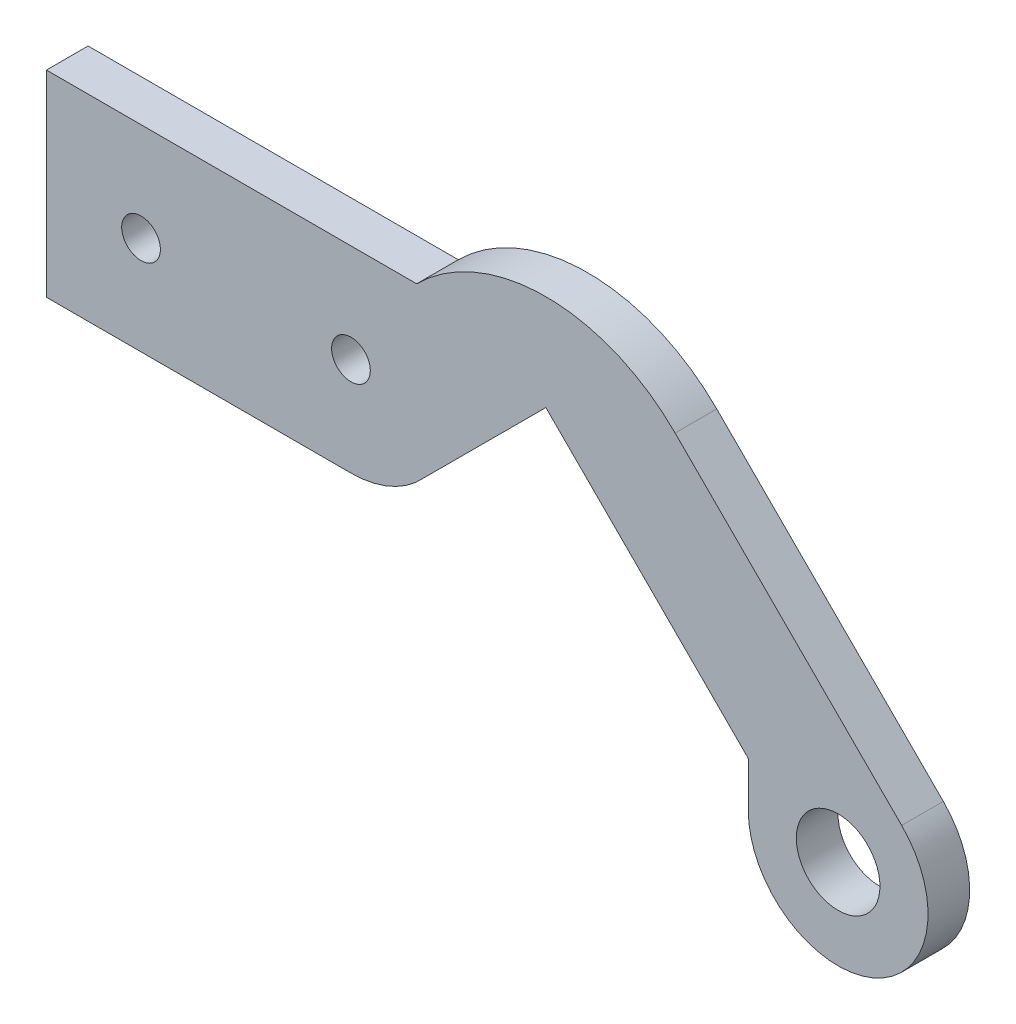
ISO-10303-21;
HEADER;
FILE_DESCRIPTION(('STEP AP214'),'2;1');
FILE_NAME('part.step','',(''),(''),'','','');
FILE_SCHEMA(('AUTOMOTIVE_DESIGN { 1 0 10303 214 1 1 1 1 }'));
ENDSEC;
DATA;
#1=APPLICATION_CONTEXT('core data for automotive mechanical design processes');
#2=APPLICATION_PROTOCOL_DEFINITION('international standard','automotive_design',2000,#1);
#3=PRODUCT_CONTEXT('',#1,'mechanical');
#4=PRODUCT('Part','Part','',(#3));
#5=PRODUCT_RELATED_PRODUCT_CATEGORY('part','',(#4));
#6=PRODUCT_DEFINITION_FORMATION('','',#4);
#7=PRODUCT_DEFINITION_CONTEXT('part definition',#1,'design');
#8=PRODUCT_DEFINITION('design','',#6,#7);
#9=PRODUCT_DEFINITION_SHAPE('','',#8);
#10=(LENGTH_UNIT() NAMED_UNIT(*) SI_UNIT(.MILLI.,.METRE.));
#11=(NAMED_UNIT(*) PLANE_ANGLE_UNIT() SI_UNIT($,.RADIAN.));
#12=(NAMED_UNIT(*) SI_UNIT($,.STERADIAN.) SOLID_ANGLE_UNIT());
#13=UNCERTAINTY_MEASURE_WITH_UNIT(LENGTH_MEASURE(1.E-05),#10,'distance_accuracy_value','');
#14=(GEOMETRIC_REPRESENTATION_CONTEXT(3) GLOBAL_UNCERTAINTY_ASSIGNED_CONTEXT((#13)) GLOBAL_UNIT_ASSIGNED_CONTEXT((#10,
#11,#12)) REPRESENTATION_CONTEXT('',''));
#15=CARTESIAN_POINT('',(0.,0.,0.));
#16=DIRECTION('',(0.,0.,1.));
#17=DIRECTION('',(1.,0.,0.));
#18=AXIS2_PLACEMENT_3D('',#15,#16,#17);
#19=CARTESIAN_POINT('',(0.,0.,3.175));
#20=DIRECTION('',(0.,0.,1.));
#21=DIRECTION('',(1.,0.,0.));
#22=AXIS2_PLACEMENT_3D('',#19,#20,#21);
#23=PLANE('',#22);
#24=CARTESIAN_POINT('',(-13.5,0.,3.175));
#25=DIRECTION('',(0.,0.,1.));
#26=DIRECTION('',(1.,0.,0.));
#27=AXIS2_PLACEMENT_3D('',#24,#25,#26);
#28=CIRCLE('',#27,1.475);
#29=CARTESIAN_POINT('',(-12.025,0.,3.175));
#30=VERTEX_POINT('',#29);
#31=EDGE_CURVE('E291',#30,#30,#28,.T.);
#32=ORIENTED_EDGE('',*,*,#31,.F.);
#33=EDGE_LOOP('',(#32));
#34=FACE_BOUND('',#33,.T.);
#35=CARTESIAN_POINT('',(2.5,0.,3.175));
#36=DIRECTION('',(0.,0.,1.));
#37=DIRECTION('',(1.,0.,0.));
#38=AXIS2_PLACEMENT_3D('',#35,#36,#37);
#39=CIRCLE('',#38,1.475);
#40=CARTESIAN_POINT('',(3.975,0.,3.175));
#41=VERTEX_POINT('',#40);
#42=EDGE_CURVE('E290',#41,#41,#39,.T.);
#43=ORIENTED_EDGE('',*,*,#42,.F.);
#44=EDGE_LOOP('',(#43));
#45=FACE_BOUND('',#44,.T.);
#46=DIRECTION('',(0.707106781186546,-0.707106781186549,0.));
#47=VECTOR('',#46,1.);
#48=CARTESIAN_POINT('',(17.3544964901299,17.3544964901299,3.175));
#49=LINE('',#48,#47);
#50=CARTESIAN_POINT('',(27.2089929802598,7.5,3.175));
#51=VERTEX_POINT('',#50);
#52=CARTESIAN_POINT('',(44.4795253726149,-9.77053239235524,3.175));
#53=VERTEX_POINT('',#52);
#54=EDGE_CURVE('E231',#51,#53,#49,.T.);
#55=ORIENTED_EDGE('',*,*,#54,.F.);
#56=CARTESIAN_POINT('',(17.3584345872163,-2.35055839304351,3.175));
#57=DIRECTION('',(0.,0.,1.));
#58=DIRECTION('',(1.,0.,0.));
#59=AXIS2_PLACEMENT_3D('',#56,#57,#58);
#60=CIRCLE('',#59,13.9307932763902);
#61=CARTESIAN_POINT('',(7.5078761941729,7.5,3.175));
#62=VERTEX_POINT('',#61);
#63=EDGE_CURVE('E228',#62,#51,#60,.F.);
#64=ORIENTED_EDGE('',*,*,#63,.F.);
#65=DIRECTION('',(1.,0.,0.));
#66=VECTOR('',#65,1.);
#67=CARTESIAN_POINT('',(-20.71,7.5,3.175));
#68=LINE('',#67,#66);
#69=CARTESIAN_POINT('',(-20.71,7.5,3.175));
#70=VERTEX_POINT('',#69);
#71=EDGE_CURVE('E216',#70,#62,#68,.T.);
#72=ORIENTED_EDGE('',*,*,#71,.F.);
#73=DIRECTION('',(0.,-1.,0.));
#74=VECTOR('',#73,1.);
#75=CARTESIAN_POINT('',(-20.71,0.,3.175));
#76=LINE('',#75,#74);
#77=CARTESIAN_POINT('',(-20.71,-7.5,3.175));
#78=VERTEX_POINT('',#77);
#79=EDGE_CURVE('E297',#70,#78,#76,.T.);
#80=ORIENTED_EDGE('',*,*,#79,.T.);
#81=DIRECTION('',(1.,0.,0.));
#82=VECTOR('',#81,1.);
#83=CARTESIAN_POINT('',(0.,-7.5,3.175));
#84=LINE('',#83,#82);
#85=CARTESIAN_POINT('',(2.5,-7.5,3.175));
#86=VERTEX_POINT('',#85);
#87=EDGE_CURVE('E12',#78,#86,#84,.T.);
#88=ORIENTED_EDGE('',*,*,#87,.T.);
#89=CARTESIAN_POINT('',(2.5,0.,3.175));
#90=DIRECTION('',(0.,0.,1.));
#91=DIRECTION('',(1.,0.,0.));
#92=AXIS2_PLACEMENT_3D('',#89,#90,#91);
#93=CIRCLE('',#92,7.5);
#94=CARTESIAN_POINT('',(8.03869510450984,-5.05696119614128,3.175));
#95=VERTEX_POINT('',#94);
#96=EDGE_CURVE('E287',#86,#95,#93,.T.);
#97=ORIENTED_EDGE('',*,*,#96,.T.);
#98=DIRECTION('',(0.707457856158301,0.706755531821223,0.));
#99=VECTOR('',#98,1.);
#100=CARTESIAN_POINT('',(6.54383474051305,-6.55033754691378,3.175));
#101=LINE('',#100,#99);
#102=CARTESIAN_POINT('',(17.3584345872163,4.25352617381113,3.175));
#103=VERTEX_POINT('',#102);
#104=EDGE_CURVE('E258',#95,#103,#101,.T.);
#105=ORIENTED_EDGE('',*,*,#104,.T.);
#106=DIRECTION('',(-0.706755531821223,0.707457856158301,0.));
#107=VECTOR('',#106,1.);
#108=CARTESIAN_POINT('',(32.7858439214871,-11.1892138434832,3.175));
#109=LINE('',#108,#107);
#110=CARTESIAN_POINT('',(32.7858439214871,-11.1892138434832,3.175));
#111=VERTEX_POINT('',#110);
#112=EDGE_CURVE('E164',#111,#103,#109,.T.);
#113=ORIENTED_EDGE('',*,*,#112,.F.);
#114=DIRECTION('',(0.,1.,0.));
#115=VECTOR('',#114,1.);
#116=CARTESIAN_POINT('',(32.7858439214871,-14.6142138434831,3.175));
#117=LINE('',#116,#115);
#118=CARTESIAN_POINT('',(32.7858439214871,-14.6142138434831,3.175));
#119=VERTEX_POINT('',#118);
#120=EDGE_CURVE('E269',#119,#111,#117,.T.);
#121=ORIENTED_EDGE('',*,*,#120,.F.);
#122=CARTESIAN_POINT('',(39.6358439214871,-14.6142138434831,3.175));
#123=DIRECTION('',(0.,0.,1.));
#124=DIRECTION('',(1.,0.,0.));
#125=AXIS2_PLACEMENT_3D('',#122,#123,#124);
#126=CIRCLE('',#125,6.85);
#127=EDGE_CURVE('E277',#53,#119,#126,.F.);
#128=ORIENTED_EDGE('',*,*,#127,.F.);
#129=EDGE_LOOP('',(#55,#64,#72,#80,#88,#97,#105,#113,#121,#128));
#130=FACE_BOUND('',#129,.T.);
#131=CARTESIAN_POINT('',(39.6358439214871,-14.6142138434831,3.175));
#132=DIRECTION('',(0.,0.,1.));
#133=DIRECTION('',(1.,0.,0.));
#134=AXIS2_PLACEMENT_3D('',#131,#132,#133);
#135=CIRCLE('',#134,3.1875);
#136=CARTESIAN_POINT('',(42.8233439214871,-14.6142138434831,3.175));
#137=VERTEX_POINT('',#136);
#138=EDGE_CURVE('E240',#137,#137,#135,.F.);
#139=ORIENTED_EDGE('',*,*,#138,.T.);
#140=EDGE_LOOP('',(#139));
#141=FACE_BOUND('',#140,.T.);
#142=ADVANCED_FACE('F139',(#34,#45,#130,#141),#23,.T.);
#143=CARTESIAN_POINT('',(0.,0.,0.));
#144=DIRECTION('',(0.,0.,1.));
#145=DIRECTION('',(1.,0.,0.));
#146=AXIS2_PLACEMENT_3D('',#143,#144,#145);
#147=PLANE('',#146);
#148=CARTESIAN_POINT('',(-13.5,0.,0.));
#149=DIRECTION('',(0.,0.,1.));
#150=DIRECTION('',(1.,0.,0.));
#151=AXIS2_PLACEMENT_3D('',#148,#149,#150);
#152=CIRCLE('',#151,1.475);
#153=CARTESIAN_POINT('',(-12.025,0.,0.));
#154=VERTEX_POINT('',#153);
#155=EDGE_CURVE('E143',#154,#154,#152,.T.);
#156=ORIENTED_EDGE('',*,*,#155,.T.);
#157=EDGE_LOOP('',(#156));
#158=FACE_BOUND('',#157,.T.);
#159=CARTESIAN_POINT('',(2.5,0.,0.));
#160=DIRECTION('',(0.,0.,1.));
#161=DIRECTION('',(1.,0.,0.));
#162=AXIS2_PLACEMENT_3D('',#159,#160,#161);
#163=CIRCLE('',#162,1.475);
#164=CARTESIAN_POINT('',(3.975,0.,0.));
#165=VERTEX_POINT('',#164);
#166=EDGE_CURVE('E294',#165,#165,#163,.T.);
#167=ORIENTED_EDGE('',*,*,#166,.T.);
#168=EDGE_LOOP('',(#167));
#169=FACE_BOUND('',#168,.T.);
#170=DIRECTION('',(1.,0.,0.));
#171=VECTOR('',#170,1.);
#172=CARTESIAN_POINT('',(-20.71,7.5,0.));
#173=LINE('',#172,#171);
#174=CARTESIAN_POINT('',(-20.71,7.5,0.));
#175=VERTEX_POINT('',#174);
#176=CARTESIAN_POINT('',(7.50787619417291,7.5,0.));
#177=VERTEX_POINT('',#176);
#178=EDGE_CURVE('E224',#175,#177,#173,.T.);
#179=ORIENTED_EDGE('',*,*,#178,.T.);
#180=CARTESIAN_POINT('',(17.3584345872163,-2.35055839304351,0.));
#181=DIRECTION('',(0.,0.,-1.));
#182=DIRECTION('',(1.,0.,0.));
#183=AXIS2_PLACEMENT_3D('',#180,#181,#182);
#184=CIRCLE('',#183,13.9307932763902);
#185=CARTESIAN_POINT('',(27.2089929802598,7.5,0.));
#186=VERTEX_POINT('',#185);
#187=EDGE_CURVE('E238',#177,#186,#184,.T.);
#188=ORIENTED_EDGE('',*,*,#187,.T.);
#189=DIRECTION('',(-0.707106781186546,0.707106781186549,0.));
#190=VECTOR('',#189,1.);
#191=CARTESIAN_POINT('',(17.3544964901299,17.3544964901299,0.));
#192=LINE('',#191,#190);
#193=CARTESIAN_POINT('',(44.4795253726149,-9.77053239235524,0.));
#194=VERTEX_POINT('',#193);
#195=EDGE_CURVE('E261',#194,#186,#192,.T.);
#196=ORIENTED_EDGE('',*,*,#195,.F.);
#197=CARTESIAN_POINT('',(39.6358439214871,-14.6142138434831,0.));
#198=DIRECTION('',(0.,0.,-1.));
#199=DIRECTION('',(-1.,0.,0.));
#200=AXIS2_PLACEMENT_3D('',#197,#198,#199);
#201=CIRCLE('',#200,6.85);
#202=CARTESIAN_POINT('',(32.7858439214871,-14.6142138434831,0.));
#203=VERTEX_POINT('',#202);
#204=EDGE_CURVE('E278',#194,#203,#201,.T.);
#205=ORIENTED_EDGE('',*,*,#204,.T.);
#206=DIRECTION('',(0.,1.,0.));
#207=VECTOR('',#206,1.);
#208=CARTESIAN_POINT('',(32.7858439214871,-14.6142138434831,0.));
#209=LINE('',#208,#207);
#210=CARTESIAN_POINT('',(32.7858439214871,-11.1892138434832,0.));
#211=VERTEX_POINT('',#210);
#212=EDGE_CURVE('E272',#203,#211,#209,.T.);
#213=ORIENTED_EDGE('',*,*,#212,.T.);
#214=DIRECTION('',(-0.706755531821223,0.707457856158301,0.));
#215=VECTOR('',#214,1.);
#216=CARTESIAN_POINT('',(32.7858439214871,-11.1892138434832,0.));
#217=LINE('',#216,#215);
#218=CARTESIAN_POINT('',(17.3584345872163,4.25352617381113,0.));
#219=VERTEX_POINT('',#218);
#220=EDGE_CURVE('E245',#211,#219,#217,.T.);
#221=ORIENTED_EDGE('',*,*,#220,.T.);
#222=DIRECTION('',(0.707457856158301,0.706755531821223,0.));
#223=VECTOR('',#222,1.);
#224=CARTESIAN_POINT('',(6.54383474051305,-6.55033754691378,0.));
#225=LINE('',#224,#223);
#226=CARTESIAN_POINT('',(8.03869510450984,-5.05696119614128,0.));
#227=VERTEX_POINT('',#226);
#228=EDGE_CURVE('E255',#227,#219,#225,.T.);
#229=ORIENTED_EDGE('',*,*,#228,.F.);
#230=CARTESIAN_POINT('',(2.5,0.,0.));
#231=DIRECTION('',(0.,0.,-1.));
#232=DIRECTION('',(-1.,0.,0.));
#233=AXIS2_PLACEMENT_3D('',#230,#231,#232);
#234=CIRCLE('',#233,7.5);
#235=CARTESIAN_POINT('',(2.5,-7.5,0.));
#236=VERTEX_POINT('',#235);
#237=EDGE_CURVE('E281',#227,#236,#234,.T.);
#238=ORIENTED_EDGE('',*,*,#237,.T.);
#239=DIRECTION('',(1.,0.,0.));
#240=VECTOR('',#239,1.);
#241=CARTESIAN_POINT('',(0.,-7.5,0.));
#242=LINE('',#241,#240);
#243=CARTESIAN_POINT('',(-20.71,-7.5,0.));
#244=VERTEX_POINT('',#243);
#245=EDGE_CURVE('E148',#244,#236,#242,.T.);
#246=ORIENTED_EDGE('',*,*,#245,.F.);
#247=DIRECTION('',(0.,1.,0.));
#248=VECTOR('',#247,1.);
#249=CARTESIAN_POINT('',(-20.71,0.,0.));
#250=LINE('',#249,#248);
#251=EDGE_CURVE('E303',#244,#175,#250,.T.);
#252=ORIENTED_EDGE('',*,*,#251,.T.);
#253=EDGE_LOOP('',(#179,#188,#196,#205,#213,#221,#229,#238,#246,#252));
#254=FACE_BOUND('',#253,.T.);
#255=CARTESIAN_POINT('',(39.6358439214871,-14.6142138434831,0.));
#256=DIRECTION('',(0.,0.,-1.));
#257=DIRECTION('',(-1.,0.,0.));
#258=AXIS2_PLACEMENT_3D('',#255,#256,#257);
#259=CIRCLE('',#258,3.1875);
#260=CARTESIAN_POINT('',(36.4483439214871,-14.6142138434831,0.));
#261=VERTEX_POINT('',#260);
#262=EDGE_CURVE('E637',#261,#261,#259,.T.);
#263=ORIENTED_EDGE('',*,*,#262,.F.);
#264=EDGE_LOOP('',(#263));
#265=FACE_BOUND('',#264,.T.);
#266=ADVANCED_FACE('F313',(#158,#169,#254,#265),#147,.F.);
#267=CARTESIAN_POINT('',(17.3544964901299,17.3544964901299,10.));
#268=DIRECTION('',(-0.707106781186549,-0.707106781186546,0.));
#269=DIRECTION('',(0.707106781186546,-0.707106781186549,0.));
#270=AXIS2_PLACEMENT_3D('',#267,#268,#269);
#271=PLANE('',#270);
#272=DIRECTION('',(0.,0.,-1.));
#273=VECTOR('',#272,1.);
#274=CARTESIAN_POINT('',(27.2089929802598,7.5,10.));
#275=LINE('',#274,#273);
#276=EDGE_CURVE('E223',#51,#186,#275,.T.);
#277=ORIENTED_EDGE('',*,*,#276,.F.);
#278=ORIENTED_EDGE('',*,*,#54,.T.);
#279=DIRECTION('',(0.,0.,-1.));
#280=VECTOR('',#279,1.);
#281=CARTESIAN_POINT('',(44.4795253726149,-9.77053239235524,10.));
#282=LINE('',#281,#280);
#283=EDGE_CURVE('E265',#53,#194,#282,.T.);
#284=ORIENTED_EDGE('',*,*,#283,.T.);
#285=ORIENTED_EDGE('',*,*,#195,.T.);
#286=EDGE_LOOP('',(#277,#278,#284,#285));
#287=FACE_BOUND('',#286,.T.);
#288=ADVANCED_FACE('F338',(#287),#271,.F.);
#289=CARTESIAN_POINT('',(2.5,0.,10.));
#290=DIRECTION('',(0.,0.,-1.));
#291=DIRECTION('',(-1.,0.,0.));
#292=AXIS2_PLACEMENT_3D('',#289,#290,#291);
#293=CYLINDRICAL_SURFACE('',#292,7.5);
#294=ORIENTED_EDGE('',*,*,#237,.F.);
#295=DIRECTION('',(0.,0.,-1.));
#296=VECTOR('',#295,1.);
#297=CARTESIAN_POINT('',(8.03869510450984,-5.05696119614128,22.7930069860334));
#298=LINE('',#297,#296);
#299=EDGE_CURVE('E252',#95,#227,#298,.T.);
#300=ORIENTED_EDGE('',*,*,#299,.F.);
#301=ORIENTED_EDGE('',*,*,#96,.F.);
#302=DIRECTION('',(0.,0.,-1.));
#303=VECTOR('',#302,1.);
#304=CARTESIAN_POINT('',(2.5,-7.5,10.));
#305=LINE('',#304,#303);
#306=EDGE_CURVE('E284',#86,#236,#305,.T.);
#307=ORIENTED_EDGE('',*,*,#306,.T.);
#308=EDGE_LOOP('',(#294,#300,#301,#307));
#309=FACE_BOUND('',#308,.T.);
#310=ADVANCED_FACE('F355',(#309),#293,.T.);
#311=CARTESIAN_POINT('',(39.6358439214871,-14.6142138434831,66.0414426696379));
#312=DIRECTION('',(0.,0.,-1.));
#313=DIRECTION('',(-1.,0.,0.));
#314=AXIS2_PLACEMENT_3D('',#311,#312,#313);
#315=CYLINDRICAL_SURFACE('',#314,6.85);
#316=DIRECTION('',(0.,0.,-1.));
#317=VECTOR('',#316,1.);
#318=CARTESIAN_POINT('',(32.7858439214871,-14.6142138434831,48.6079332700379));
#319=LINE('',#318,#317);
#320=EDGE_CURVE('E270',#119,#203,#319,.T.);
#321=ORIENTED_EDGE('',*,*,#320,.T.);
#322=ORIENTED_EDGE('',*,*,#204,.F.);
#323=ORIENTED_EDGE('',*,*,#283,.F.);
#324=ORIENTED_EDGE('',*,*,#127,.T.);
#325=EDGE_LOOP('',(#321,#322,#323,#324));
#326=FACE_BOUND('',#325,.T.);
#327=ADVANCED_FACE('F347',(#326),#315,.T.);
#328=CARTESIAN_POINT('',(0.,-7.5,3.175));
#329=DIRECTION('',(0.,1.,0.));
#330=DIRECTION('',(0.,0.,1.));
#331=AXIS2_PLACEMENT_3D('',#328,#329,#330);
#332=PLANE('',#331);
#333=ORIENTED_EDGE('',*,*,#306,.F.);
#334=ORIENTED_EDGE('',*,*,#87,.F.);
#335=DIRECTION('',(0.,0.,1.));
#336=VECTOR('',#335,1.);
#337=CARTESIAN_POINT('',(-20.71,-7.5,3.175));
#338=LINE('',#337,#336);
#339=EDGE_CURVE('E299',#244,#78,#338,.T.);
#340=ORIENTED_EDGE('',*,*,#339,.F.);
#341=ORIENTED_EDGE('',*,*,#245,.T.);
#342=EDGE_LOOP('',(#333,#334,#340,#341));
#343=FACE_BOUND('',#342,.T.);
#344=ADVANCED_FACE('F141',(#343),#332,.F.);
#345=CARTESIAN_POINT('',(-20.71,0.,-6.825));
#346=DIRECTION('',(1.,0.,0.));
#347=DIRECTION('',(0.,0.,-1.));
#348=AXIS2_PLACEMENT_3D('',#345,#346,#347);
#349=PLANE('',#348);
#350=DIRECTION('',(0.,0.,-1.));
#351=VECTOR('',#350,1.);
#352=CARTESIAN_POINT('',(-20.71,7.5,3.175));
#353=LINE('',#352,#351);
#354=EDGE_CURVE('E220',#70,#175,#353,.T.);
#355=ORIENTED_EDGE('',*,*,#354,.T.);
#356=ORIENTED_EDGE('',*,*,#251,.F.);
#357=ORIENTED_EDGE('',*,*,#339,.T.);
#358=ORIENTED_EDGE('',*,*,#79,.F.);
#359=EDGE_LOOP('',(#355,#356,#357,#358));
#360=FACE_BOUND('',#359,.T.);
#361=ADVANCED_FACE('F328',(#360),#349,.F.);
#362=CARTESIAN_POINT('',(2.5,0.,-12.825));
#363=DIRECTION('',(0.,0.,1.));
#364=DIRECTION('',(1.,0.,0.));
#365=AXIS2_PLACEMENT_3D('',#362,#363,#364);
#366=CYLINDRICAL_SURFACE('',#365,1.475);
#367=ORIENTED_EDGE('',*,*,#42,.T.);
#368=EDGE_LOOP('',(#367));
#369=FACE_BOUND('',#368,.T.);
#370=ORIENTED_EDGE('',*,*,#166,.F.);
#371=EDGE_LOOP('',(#370));
#372=FACE_BOUND('',#371,.T.);
#373=ADVANCED_FACE('F318',(#369,#372),#366,.F.);
#374=CARTESIAN_POINT('',(-13.5,0.,-12.825));
#375=DIRECTION('',(0.,0.,1.));
#376=DIRECTION('',(1.,0.,0.));
#377=AXIS2_PLACEMENT_3D('',#374,#375,#376);
#378=CYLINDRICAL_SURFACE('',#377,1.475);
#379=ORIENTED_EDGE('',*,*,#31,.T.);
#380=EDGE_LOOP('',(#379));
#381=FACE_BOUND('',#380,.T.);
#382=ORIENTED_EDGE('',*,*,#155,.F.);
#383=EDGE_LOOP('',(#382));
#384=FACE_BOUND('',#383,.T.);
#385=ADVANCED_FACE('F315',(#381,#384),#378,.F.);
#386=CARTESIAN_POINT('',(32.7858439214871,-14.6142138434831,48.6079332700379));
#387=DIRECTION('',(-1.,0.,0.));
#388=DIRECTION('',(0.,0.,1.));
#389=AXIS2_PLACEMENT_3D('',#386,#387,#388);
#390=PLANE('',#389);
#391=DIRECTION('',(0.,0.,-1.));
#392=VECTOR('',#391,1.);
#393=CARTESIAN_POINT('',(32.7858439214871,-11.1892138434832,26.2404555706567));
#394=LINE('',#393,#392);
#395=EDGE_CURVE('E248',#111,#211,#394,.T.);
#396=ORIENTED_EDGE('',*,*,#395,.T.);
#397=ORIENTED_EDGE('',*,*,#212,.F.);
#398=ORIENTED_EDGE('',*,*,#320,.F.);
#399=ORIENTED_EDGE('',*,*,#120,.T.);
#400=EDGE_LOOP('',(#396,#397,#398,#399));
#401=FACE_BOUND('',#400,.T.);
#402=ADVANCED_FACE('F317',(#401),#390,.T.);
#403=CARTESIAN_POINT('',(6.54383474051305,-6.55033754691378,22.7930069860334));
#404=DIRECTION('',(-0.706755531821223,0.707457856158301,0.));
#405=DIRECTION('',(-0.707457856158301,-0.706755531821223,0.));
#406=AXIS2_PLACEMENT_3D('',#403,#404,#405);
#407=PLANE('',#406);
#408=ORIENTED_EDGE('',*,*,#228,.T.);
#409=DIRECTION('',(0.,0.,-1.));
#410=VECTOR('',#409,1.);
#411=CARTESIAN_POINT('',(17.3584345872163,4.25352617381113,26.2404555706567));
#412=LINE('',#411,#410);
#413=EDGE_CURVE('E250',#103,#219,#412,.T.);
#414=ORIENTED_EDGE('',*,*,#413,.F.);
#415=ORIENTED_EDGE('',*,*,#104,.F.);
#416=ORIENTED_EDGE('',*,*,#299,.T.);
#417=EDGE_LOOP('',(#408,#414,#415,#416));
#418=FACE_BOUND('',#417,.T.);
#419=ADVANCED_FACE('F325',(#418),#407,.F.);
#420=CARTESIAN_POINT('',(32.7858439214871,-11.1892138434832,26.2404555706567));
#421=DIRECTION('',(-0.707457856158301,-0.706755531821223,0.));
#422=DIRECTION('',(0.706755531821223,-0.707457856158301,0.));
#423=AXIS2_PLACEMENT_3D('',#420,#421,#422);
#424=PLANE('',#423);
#425=ORIENTED_EDGE('',*,*,#395,.F.);
#426=ORIENTED_EDGE('',*,*,#112,.T.);
#427=ORIENTED_EDGE('',*,*,#413,.T.);
#428=ORIENTED_EDGE('',*,*,#220,.F.);
#429=EDGE_LOOP('',(#425,#426,#427,#428));
#430=FACE_BOUND('',#429,.T.);
#431=ADVANCED_FACE('F361',(#430),#424,.T.);
#432=CARTESIAN_POINT('',(-20.71,7.5,54.5776623562401));
#433=DIRECTION('',(0.,1.,0.));
#434=DIRECTION('',(0.,0.,1.));
#435=AXIS2_PLACEMENT_3D('',#432,#433,#434);
#436=PLANE('',#435);
#437=DIRECTION('',(0.,0.,-1.));
#438=VECTOR('',#437,1.);
#439=CARTESIAN_POINT('',(7.5078761941729,7.5,23.2942027506637));
#440=LINE('',#439,#438);
#441=EDGE_CURVE('E156',#62,#177,#440,.T.);
#442=ORIENTED_EDGE('',*,*,#441,.T.);
#443=ORIENTED_EDGE('',*,*,#178,.F.);
#444=ORIENTED_EDGE('',*,*,#354,.F.);
#445=ORIENTED_EDGE('',*,*,#71,.T.);
#446=EDGE_LOOP('',(#442,#443,#444,#445));
#447=FACE_BOUND('',#446,.T.);
#448=ADVANCED_FACE('F218',(#447),#436,.T.);
#449=CARTESIAN_POINT('',(17.3584345872163,-2.35055839304351,23.2942027506637));
#450=DIRECTION('',(0.,0.,-1.));
#451=DIRECTION('',(-1.,0.,0.));
#452=AXIS2_PLACEMENT_3D('',#449,#450,#451);
#453=CYLINDRICAL_SURFACE('',#452,13.9307932763902);
#454=ORIENTED_EDGE('',*,*,#441,.F.);
#455=ORIENTED_EDGE('',*,*,#63,.T.);
#456=ORIENTED_EDGE('',*,*,#276,.T.);
#457=ORIENTED_EDGE('',*,*,#187,.F.);
#458=EDGE_LOOP('',(#454,#455,#456,#457));
#459=FACE_BOUND('',#458,.T.);
#460=ADVANCED_FACE('F236',(#459),#453,.T.);
#461=CARTESIAN_POINT('',(39.6358439214871,-14.6142138434831,22.1711669907536));
#462=DIRECTION('',(0.,0.,-1.));
#463=DIRECTION('',(-1.,0.,0.));
#464=AXIS2_PLACEMENT_3D('',#461,#462,#463);
#465=CYLINDRICAL_SURFACE('',#464,3.1875);
#466=ORIENTED_EDGE('',*,*,#262,.T.);
#467=EDGE_LOOP('',(#466));
#468=FACE_BOUND('',#467,.T.);
#469=ORIENTED_EDGE('',*,*,#138,.F.);
#470=EDGE_LOOP('',(#469));
#471=FACE_BOUND('',#470,.T.);
#472=ADVANCED_FACE('F439',(#468,#471),#465,.F.);
#473=CLOSED_SHELL('',(#142,#266,#288,#310,#327,#344,#361,#373,#385,#402,#419,#431,#448,#460,#472));
#474=MANIFOLD_SOLID_BREP('B2',#473);
#475=ADVANCED_BREP_SHAPE_REPRESENTATION('',(#18,#474),#14);
#476=SHAPE_DEFINITION_REPRESENTATION(#9,#475);
ENDSEC;
END-ISO-10303-21;
